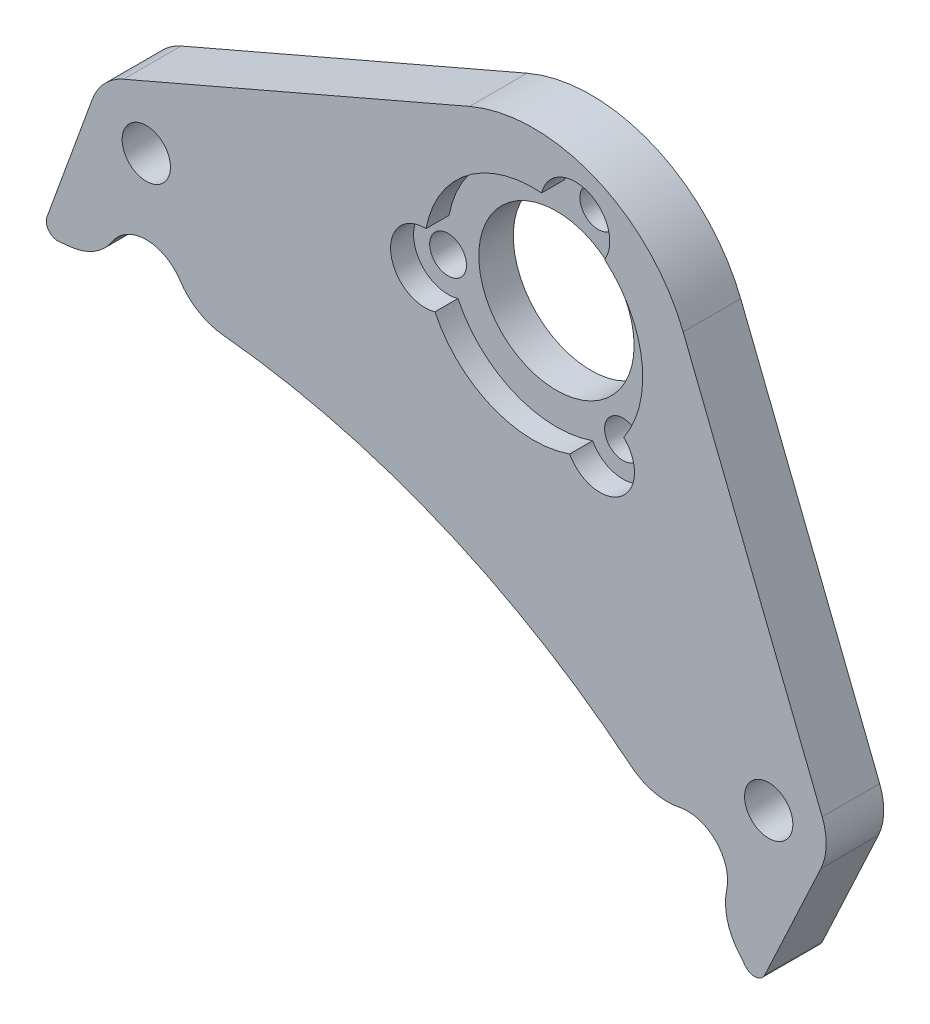
ISO-10303-21;
HEADER;
FILE_DESCRIPTION(('STEP AP214'),'2;1');
FILE_NAME('part.step','',(''),(''),'','','');
FILE_SCHEMA(('AUTOMOTIVE_DESIGN { 1 0 10303 214 1 1 1 1 }'));
ENDSEC;
DATA;
#1=APPLICATION_CONTEXT('core data for automotive mechanical design processes');
#2=APPLICATION_PROTOCOL_DEFINITION('international standard','automotive_design',2000,#1);
#3=PRODUCT_CONTEXT('',#1,'mechanical');
#4=PRODUCT('Part','Part','',(#3));
#5=PRODUCT_RELATED_PRODUCT_CATEGORY('part','',(#4));
#6=PRODUCT_DEFINITION_FORMATION('','',#4);
#7=PRODUCT_DEFINITION_CONTEXT('part definition',#1,'design');
#8=PRODUCT_DEFINITION('design','',#6,#7);
#9=PRODUCT_DEFINITION_SHAPE('','',#8);
#10=(LENGTH_UNIT() NAMED_UNIT(*) SI_UNIT(.MILLI.,.METRE.));
#11=(NAMED_UNIT(*) PLANE_ANGLE_UNIT() SI_UNIT($,.RADIAN.));
#12=(NAMED_UNIT(*) SI_UNIT($,.STERADIAN.) SOLID_ANGLE_UNIT());
#13=UNCERTAINTY_MEASURE_WITH_UNIT(LENGTH_MEASURE(1.E-05),#10,'distance_accuracy_value','');
#14=(GEOMETRIC_REPRESENTATION_CONTEXT(3) GLOBAL_UNCERTAINTY_ASSIGNED_CONTEXT((#13)) GLOBAL_UNIT_ASSIGNED_CONTEXT((#10,
#11,#12)) REPRESENTATION_CONTEXT('',''));
#15=CARTESIAN_POINT('',(0.,0.,0.));
#16=DIRECTION('',(0.,0.,1.));
#17=DIRECTION('',(1.,0.,0.));
#18=AXIS2_PLACEMENT_3D('',#15,#16,#17);
#19=CARTESIAN_POINT('',(33.6474407907006,81.2321078960549,5.));
#20=DIRECTION('',(0.,0.,-1.));
#21=DIRECTION('',(-1.,0.,0.));
#22=AXIS2_PLACEMENT_3D('',#19,#20,#21);
#23=CYLINDRICAL_SURFACE('',#22,6.75000000000001);
#24=CARTESIAN_POINT('',(33.6474407907006,81.2321078960549,0.));
#25=DIRECTION('',(0.,0.,1.));
#26=DIRECTION('',(1.,0.,0.));
#27=AXIS2_PLACEMENT_3D('',#24,#25,#26);
#28=CIRCLE('',#27,6.75000000000001);
#29=CARTESIAN_POINT('',(40.3974407907006,81.2321078960549,0.));
#30=VERTEX_POINT('',#29);
#31=EDGE_CURVE('E275',#30,#30,#28,.T.);
#32=ORIENTED_EDGE('',*,*,#31,.F.);
#33=EDGE_LOOP('',(#32));
#34=FACE_BOUND('',#33,.T.);
#35=CARTESIAN_POINT('',(33.6474407907006,81.2321078960549,3.));
#36=DIRECTION('',(0.,0.,1.));
#37=DIRECTION('',(1.,0.,0.));
#38=AXIS2_PLACEMENT_3D('',#35,#36,#37);
#39=CIRCLE('',#38,6.75000000000001);
#40=CARTESIAN_POINT('',(40.3974407907006,81.2321078960549,3.));
#41=VERTEX_POINT('',#40);
#42=EDGE_CURVE('E11',#41,#41,#39,.T.);
#43=ORIENTED_EDGE('',*,*,#42,.T.);
#44=EDGE_LOOP('',(#43));
#45=FACE_BOUND('',#44,.T.);
#46=ADVANCED_FACE('F45',(#34,#45),#23,.F.);
#47=CARTESIAN_POINT('',(37.282933398169,90.0089634549121,5.));
#48=DIRECTION('',(0.,0.,-1.));
#49=DIRECTION('',(-1.,0.,0.));
#50=AXIS2_PLACEMENT_3D('',#47,#48,#49);
#51=CYLINDRICAL_SURFACE('',#50,1.60000000000001);
#52=CARTESIAN_POINT('',(37.282933398169,90.0089634549121,0.));
#53=DIRECTION('',(0.,0.,1.));
#54=DIRECTION('',(1.,0.,0.));
#55=AXIS2_PLACEMENT_3D('',#52,#53,#54);
#56=CIRCLE('',#55,1.60000000000001);
#57=CARTESIAN_POINT('',(38.882933398169,90.0089634549121,0.));
#58=VERTEX_POINT('',#57);
#59=EDGE_CURVE('E290',#58,#58,#56,.T.);
#60=ORIENTED_EDGE('',*,*,#59,.F.);
#61=EDGE_LOOP('',(#60));
#62=FACE_BOUND('',#61,.T.);
#63=CARTESIAN_POINT('',(37.282933398169,90.0089634549121,3.));
#64=DIRECTION('',(0.,0.,1.));
#65=DIRECTION('',(1.,0.,0.));
#66=AXIS2_PLACEMENT_3D('',#63,#64,#65);
#67=CIRCLE('',#66,1.60000000000001);
#68=CARTESIAN_POINT('',(38.882933398169,90.0089634549121,3.));
#69=VERTEX_POINT('',#68);
#70=EDGE_CURVE('E258',#69,#69,#67,.T.);
#71=ORIENTED_EDGE('',*,*,#70,.T.);
#72=EDGE_LOOP('',(#71));
#73=FACE_BOUND('',#72,.T.);
#74=ADVANCED_FACE('F574',(#62,#73),#51,.F.);
#75=CARTESIAN_POINT('',(39.4306743662834,73.6952511632881,5.));
#76=DIRECTION('',(0.,0.,-1.));
#77=DIRECTION('',(-1.,0.,0.));
#78=AXIS2_PLACEMENT_3D('',#75,#76,#77);
#79=CYLINDRICAL_SURFACE('',#78,1.60000000000002);
#80=CARTESIAN_POINT('',(39.4306743662834,73.6952511632881,0.));
#81=DIRECTION('',(0.,0.,1.));
#82=DIRECTION('',(1.,0.,0.));
#83=AXIS2_PLACEMENT_3D('',#80,#81,#82);
#84=CIRCLE('',#83,1.60000000000002);
#85=CARTESIAN_POINT('',(41.0306743662834,73.6952511632881,0.));
#86=VERTEX_POINT('',#85);
#87=EDGE_CURVE('E286',#86,#86,#84,.T.);
#88=ORIENTED_EDGE('',*,*,#87,.F.);
#89=EDGE_LOOP('',(#88));
#90=FACE_BOUND('',#89,.T.);
#91=CARTESIAN_POINT('',(39.4306743662834,73.6952511632881,3.));
#92=DIRECTION('',(0.,0.,1.));
#93=DIRECTION('',(1.,0.,0.));
#94=AXIS2_PLACEMENT_3D('',#91,#92,#93);
#95=CIRCLE('',#94,1.60000000000002);
#96=CARTESIAN_POINT('',(41.0306743662834,73.6952511632881,3.));
#97=VERTEX_POINT('',#96);
#98=EDGE_CURVE('E235',#97,#97,#95,.T.);
#99=ORIENTED_EDGE('',*,*,#98,.T.);
#100=EDGE_LOOP('',(#99));
#101=FACE_BOUND('',#100,.T.);
#102=ADVANCED_FACE('F581',(#90,#101),#79,.F.);
#103=CARTESIAN_POINT('',(24.2287146076494,79.9921090699644,5.));
#104=DIRECTION('',(0.,0.,-1.));
#105=DIRECTION('',(-1.,0.,0.));
#106=AXIS2_PLACEMENT_3D('',#103,#104,#105);
#107=CYLINDRICAL_SURFACE('',#106,1.60000000000001);
#108=CARTESIAN_POINT('',(24.2287146076494,79.9921090699644,0.));
#109=DIRECTION('',(0.,0.,1.));
#110=DIRECTION('',(1.,0.,0.));
#111=AXIS2_PLACEMENT_3D('',#108,#109,#110);
#112=CIRCLE('',#111,1.60000000000001);
#113=CARTESIAN_POINT('',(25.8287146076494,79.9921090699644,0.));
#114=VERTEX_POINT('',#113);
#115=EDGE_CURVE('E282',#114,#114,#112,.T.);
#116=ORIENTED_EDGE('',*,*,#115,.F.);
#117=EDGE_LOOP('',(#116));
#118=FACE_BOUND('',#117,.T.);
#119=CARTESIAN_POINT('',(24.2287146076494,79.9921090699644,3.));
#120=DIRECTION('',(0.,0.,1.));
#121=DIRECTION('',(1.,0.,0.));
#122=AXIS2_PLACEMENT_3D('',#119,#120,#121);
#123=CIRCLE('',#122,1.60000000000001);
#124=CARTESIAN_POINT('',(25.8287146076494,79.9921090699644,3.));
#125=VERTEX_POINT('',#124);
#126=EDGE_CURVE('E230',#125,#125,#123,.T.);
#127=ORIENTED_EDGE('',*,*,#126,.T.);
#128=EDGE_LOOP('',(#127));
#129=FACE_BOUND('',#128,.T.);
#130=ADVANCED_FACE('F590',(#118,#129),#107,.F.);
#131=CARTESIAN_POINT('',(0.,76.5,5.));
#132=DIRECTION('',(0.,0.,-1.));
#133=DIRECTION('',(-1.,0.,0.));
#134=AXIS2_PLACEMENT_3D('',#131,#132,#133);
#135=PLANE('',#134);
#136=DIRECTION('',(-0.342020143325663,-0.93969262078591,0.));
#137=VECTOR('',#136,1.);
#138=CARTESIAN_POINT('',(-4.69846310392955,78.2101007166283,5.));
#139=LINE('',#138,#137);
#140=CARTESIAN_POINT('',(-4.69846310392955,78.2101007166283,5.));
#141=VERTEX_POINT('',#140);
#142=CARTESIAN_POINT('',(-8.6321964664029,67.4022571290773,5.));
#143=VERTEX_POINT('',#142);
#144=EDGE_CURVE('E299',#141,#143,#139,.T.);
#145=ORIENTED_EDGE('',*,*,#144,.T.);
#146=CARTESIAN_POINT('',(-7.69250384561699,67.0602369857516,5.));
#147=DIRECTION('',(0.,0.,-1.));
#148=DIRECTION('',(-1.,0.,0.));
#149=AXIS2_PLACEMENT_3D('',#146,#147,#148);
#150=CIRCLE('',#149,1.);
#151=CARTESIAN_POINT('',(-7.57854082568193,66.0667519933701,5.));
#152=VERTEX_POINT('',#151);
#153=EDGE_CURVE('E472',#143,#152,#150,.F.);
#154=ORIENTED_EDGE('',*,*,#153,.T.);
#155=CARTESIAN_POINT('',(0.,0.,5.));
#156=DIRECTION('',(0.,0.,-1.));
#157=DIRECTION('',(-1.,0.,0.));
#158=AXIS2_PLACEMENT_3D('',#155,#156,#157);
#159=CIRCLE('',#158,66.5);
#160=CARTESIAN_POINT('',(-6.62092343232267,66.1695804195804,5.));
#161=VERTEX_POINT('',#160);
#162=EDGE_CURVE('E304',#152,#161,#159,.T.);
#163=ORIENTED_EDGE('',*,*,#162,.T.);
#164=CARTESIAN_POINT('',(-7.11873722422663,71.1447368421053,5.));
#165=DIRECTION('',(0.,0.,-1.));
#166=DIRECTION('',(-1.,0.,0.));
#167=AXIS2_PLACEMENT_3D('',#164,#165,#166);
#168=CIRCLE('',#167,5.);
#169=CARTESIAN_POINT('',(-2.93124473938744,68.4125386996904,5.));
#170=VERTEX_POINT('',#169);
#171=EDGE_CURVE('E435',#161,#170,#168,.F.);
#172=ORIENTED_EDGE('',*,*,#171,.T.);
#173=CARTESIAN_POINT('',(0.,66.5,5.));
#174=DIRECTION('',(0.,0.,-1.));
#175=DIRECTION('',(-1.,0.,0.));
#176=AXIS2_PLACEMENT_3D('',#173,#174,#175);
#177=CIRCLE('',#176,3.5);
#178=CARTESIAN_POINT('',(2.93124473938744,68.4125386996904,5.));
#179=VERTEX_POINT('',#178);
#180=EDGE_CURVE('E307',#170,#179,#177,.T.);
#181=ORIENTED_EDGE('',*,*,#180,.T.);
#182=CARTESIAN_POINT('',(7.11873722422665,71.1447368421053,5.));
#183=DIRECTION('',(0.,0.,-1.));
#184=DIRECTION('',(-1.,0.,0.));
#185=AXIS2_PLACEMENT_3D('',#182,#183,#184);
#186=CIRCLE('',#185,5.);
#187=CARTESIAN_POINT('',(6.62092343232268,66.1695804195804,5.));
#188=VERTEX_POINT('',#187);
#189=EDGE_CURVE('E432',#179,#188,#186,.F.);
#190=ORIENTED_EDGE('',*,*,#189,.T.);
#191=CARTESIAN_POINT('',(0.,0.,5.));
#192=DIRECTION('',(0.,0.,-1.));
#193=DIRECTION('',(-1.,0.,0.));
#194=AXIS2_PLACEMENT_3D('',#191,#192,#193);
#195=CIRCLE('',#194,66.5);
#196=CARTESIAN_POINT('',(42.1072591662417,51.4706588796661,5.));
#197=VERTEX_POINT('',#196);
#198=EDGE_CURVE('E311',#188,#197,#195,.T.);
#199=ORIENTED_EDGE('',*,*,#198,.T.);
#200=CARTESIAN_POINT('',(45.2732185020494,55.3406332315207,5.));
#201=DIRECTION('',(0.,0.,-1.));
#202=DIRECTION('',(-1.,0.,0.));
#203=AXIS2_PLACEMENT_3D('',#200,#201,#202);
#204=CIRCLE('',#203,5.);
#205=CARTESIAN_POINT('',(46.3022670002,50.4476730652764,5.));
#206=VERTEX_POINT('',#205);
#207=EDGE_CURVE('E429',#197,#206,#204,.F.);
#208=ORIENTED_EDGE('',*,*,#207,.T.);
#209=CARTESIAN_POINT('',(47.0226009489055,47.0226009489053,5.));
#210=DIRECTION('',(0.,0.,-1.));
#211=DIRECTION('',(-1.,0.,0.));
#212=AXIS2_PLACEMENT_3D('',#209,#210,#211);
#213=CIRCLE('',#212,3.5);
#214=CARTESIAN_POINT('',(50.4476730652765,46.3022670001999,5.));
#215=VERTEX_POINT('',#214);
#216=EDGE_CURVE('E315',#206,#215,#213,.T.);
#217=ORIENTED_EDGE('',*,*,#216,.T.);
#218=CARTESIAN_POINT('',(55.3406332315209,45.2732185020493,5.));
#219=DIRECTION('',(0.,0.,-1.));
#220=DIRECTION('',(-1.,0.,0.));
#221=AXIS2_PLACEMENT_3D('',#218,#219,#220);
#222=CIRCLE('',#221,5.);
#223=CARTESIAN_POINT('',(51.4706588796662,42.1072591662416,5.));
#224=VERTEX_POINT('',#223);
#225=EDGE_CURVE('E426',#215,#224,#222,.F.);
#226=ORIENTED_EDGE('',*,*,#225,.T.);
#227=CARTESIAN_POINT('',(0.,0.,5.));
#228=DIRECTION('',(0.,0.,-1.));
#229=DIRECTION('',(-1.,0.,0.));
#230=AXIS2_PLACEMENT_3D('',#227,#228,#229);
#231=CIRCLE('',#230,66.5);
#232=CARTESIAN_POINT('',(52.0750859548207,41.357410736143,5.));
#233=VERTEX_POINT('',#232);
#234=EDGE_CURVE('E319',#224,#233,#231,.T.);
#235=ORIENTED_EDGE('',*,*,#234,.T.);
#236=CARTESIAN_POINT('',(52.8581699541414,41.9793266870624,5.));
#237=DIRECTION('',(0.,0.,-1.));
#238=DIRECTION('',(-1.,0.,0.));
#239=AXIS2_PLACEMENT_3D('',#236,#237,#238);
#240=CIRCLE('',#239,1.);
#241=CARTESIAN_POINT('',(53.764477741178,41.5567084253217,5.));
#242=VERTEX_POINT('',#241);
#243=EDGE_CURVE('E469',#233,#242,#240,.F.);
#244=ORIENTED_EDGE('',*,*,#243,.T.);
#245=DIRECTION('',(0.422618261740706,0.906307787036647,0.));
#246=VECTOR('',#245,1.);
#247=CARTESIAN_POINT('',(53.0715427057586,40.0707044464013,5.));
#248=LINE('',#247,#246);
#249=CARTESIAN_POINT('',(58.6252076959542,51.9805774520673,5.));
#250=VERTEX_POINT('',#249);
#251=EDGE_CURVE('E323',#242,#250,#248,.T.);
#252=ORIENTED_EDGE('',*,*,#251,.T.);
#253=CARTESIAN_POINT('',(54.0936687607709,54.0936687607709,5.));
#254=DIRECTION('',(0.,0.,1.));
#255=DIRECTION('',(-1.,0.,0.));
#256=AXIS2_PLACEMENT_3D('',#253,#254,#255);
#257=CIRCLE('',#256,5.00000000000013);
#258=CARTESIAN_POINT('',(58.7414212840115,55.937142786276,5.));
#259=VERTEX_POINT('',#258);
#260=EDGE_CURVE('E326',#250,#259,#257,.T.);
#261=ORIENTED_EDGE('',*,*,#260,.T.);
#262=DIRECTION('',(-0.368694805101005,0.929550504648097,0.));
#263=VECTOR('',#262,1.);
#264=CARTESIAN_POINT('',(58.7414212840115,55.937142786276,5.));
#265=LINE('',#264,#263);
#266=CARTESIAN_POINT('',(46.661147855774,86.3938351674689,5.));
#267=VERTEX_POINT('',#266);
#268=EDGE_CURVE('E329',#259,#267,#265,.T.);
#269=ORIENTED_EDGE('',*,*,#268,.T.);
#270=CARTESIAN_POINT('',(33.6474407907006,81.2321078960549,5.));
#271=DIRECTION('',(0.,0.,1.));
#272=DIRECTION('',(-1.,0.,0.));
#273=AXIS2_PLACEMENT_3D('',#270,#271,#272);
#274=CIRCLE('',#273,14.);
#275=CARTESIAN_POINT('',(28.0952526328644,94.0840807663959,5.));
#276=VERTEX_POINT('',#275);
#277=EDGE_CURVE('E332',#267,#276,#274,.T.);
#278=ORIENTED_EDGE('',*,*,#277,.T.);
#279=DIRECTION('',(-0.917998062167219,-0.396584868416875,0.));
#280=VECTOR('',#279,1.);
#281=CARTESIAN_POINT('',(-1.98292434208429,81.0899903108361,5.));
#282=LINE('',#281,#280);
#283=CARTESIAN_POINT('',(-1.98292434208429,81.0899903108361,5.));
#284=VERTEX_POINT('',#283);
#285=EDGE_CURVE('E335',#276,#284,#282,.T.);
#286=ORIENTED_EDGE('',*,*,#285,.T.);
#287=CARTESIAN_POINT('',(0.,76.5,5.));
#288=DIRECTION('',(0.,0.,1.));
#289=DIRECTION('',(-1.,0.,0.));
#290=AXIS2_PLACEMENT_3D('',#287,#288,#289);
#291=CIRCLE('',#290,5.);
#292=EDGE_CURVE('E295',#284,#141,#291,.T.);
#293=ORIENTED_EDGE('',*,*,#292,.T.);
#294=EDGE_LOOP('',(#145,#154,#163,#172,#181,#190,#199,#208,#217,#226,#235,#244,#252,#261,#269,
#278,#286,#293));
#295=FACE_BOUND('',#294,.T.);
#296=CARTESIAN_POINT('',(24.228714607649,79.9921090699647,5.));
#297=DIRECTION('',(0.,0.,1.));
#298=DIRECTION('',(1.,0.,0.));
#299=AXIS2_PLACEMENT_3D('',#296,#297,#298);
#300=CIRCLE('',#299,3.00000000000001);
#301=CARTESIAN_POINT('',(24.3116797888947,82.990961646985,5.));
#302=VERTEX_POINT('',#301);
#303=CARTESIAN_POINT('',(25.0850129792844,77.1169128855741,5.));
#304=VERTEX_POINT('',#303);
#305=EDGE_CURVE('E248',#302,#304,#300,.T.);
#306=ORIENTED_EDGE('',*,*,#305,.F.);
#307=CARTESIAN_POINT('',(33.6474407907006,81.2321078960549,5.));
#308=DIRECTION('',(0.,0.,1.));
#309=DIRECTION('',(1.,0.,0.));
#310=AXIS2_PLACEMENT_3D('',#307,#308,#309);
#311=CIRCLE('',#310,9.49999999999999);
#312=CARTESIAN_POINT('',(34.3647912758049,90.7049854040521,5.));
#313=VERTEX_POINT('',#312);
#314=EDGE_CURVE('E890',#313,#302,#311,.T.);
#315=ORIENTED_EDGE('',*,*,#314,.F.);
#316=CARTESIAN_POINT('',(37.282933398169,90.0089634549121,5.));
#317=DIRECTION('',(0.,0.,1.));
#318=DIRECTION('',(1.,0.,0.));
#319=AXIS2_PLACEMENT_3D('',#316,#317,#318);
#320=CIRCLE('',#319,3.);
#321=CARTESIAN_POINT('',(39.8385333214503,88.437687211814,5.));
#322=VERTEX_POINT('',#321);
#323=EDGE_CURVE('E223',#322,#313,#320,.T.);
#324=ORIENTED_EDGE('',*,*,#323,.F.);
#325=CARTESIAN_POINT('',(41.4925181170123,75.8744253985388,5.));
#326=VERTEX_POINT('',#325);
#327=EDGE_CURVE('E891',#326,#322,#311,.T.);
#328=ORIENTED_EDGE('',*,*,#327,.F.);
#329=CARTESIAN_POINT('',(39.4306743662834,73.6952511632881,5.));
#330=DIRECTION('',(0.,0.,1.));
#331=DIRECTION('',(1.,0.,0.));
#332=AXIS2_PLACEMENT_3D('',#329,#330,#331);
#333=CIRCLE('',#332,3.00000000000005);
#334=CARTESIAN_POINT('',(36.7921092617568,72.267674829366,5.));
#335=VERTEX_POINT('',#334);
#336=EDGE_CURVE('E237',#335,#326,#333,.T.);
#337=ORIENTED_EDGE('',*,*,#336,.F.);
#338=EDGE_CURVE('E881',#304,#335,#311,.T.);
#339=ORIENTED_EDGE('',*,*,#338,.F.);
#340=EDGE_LOOP('',(#306,#315,#324,#328,#337,#339));
#341=FACE_BOUND('',#340,.T.);
#342=CARTESIAN_POINT('',(0.,76.5,5.));
#343=DIRECTION('',(0.,0.,1.));
#344=DIRECTION('',(1.,0.,0.));
#345=AXIS2_PLACEMENT_3D('',#342,#343,#344);
#346=CIRCLE('',#345,2.09999999999998);
#347=CARTESIAN_POINT('',(2.09999999999999,76.5,5.));
#348=VERTEX_POINT('',#347);
#349=EDGE_CURVE('E271',#348,#348,#346,.T.);
#350=ORIENTED_EDGE('',*,*,#349,.F.);
#351=EDGE_LOOP('',(#350));
#352=FACE_BOUND('',#351,.T.);
#353=CARTESIAN_POINT('',(54.0936687607709,54.0936687607709,5.));
#354=DIRECTION('',(0.,0.,1.));
#355=DIRECTION('',(1.,0.,0.));
#356=AXIS2_PLACEMENT_3D('',#353,#354,#355);
#357=CIRCLE('',#356,2.09999999999999);
#358=CARTESIAN_POINT('',(56.1936687607709,54.0936687607709,5.));
#359=VERTEX_POINT('',#358);
#360=EDGE_CURVE('E263',#359,#359,#357,.T.);
#361=ORIENTED_EDGE('',*,*,#360,.F.);
#362=EDGE_LOOP('',(#361));
#363=FACE_BOUND('',#362,.T.);
#364=ADVANCED_FACE('F488',(#295,#341,#352,#363),#135,.F.);
#365=CARTESIAN_POINT('',(0.,76.5,0.));
#366=DIRECTION('',(0.,0.,-1.));
#367=DIRECTION('',(-1.,0.,0.));
#368=AXIS2_PLACEMENT_3D('',#365,#366,#367);
#369=PLANE('',#368);
#370=CARTESIAN_POINT('',(0.,76.5,0.));
#371=DIRECTION('',(0.,0.,1.));
#372=DIRECTION('',(1.,0.,0.));
#373=AXIS2_PLACEMENT_3D('',#370,#371,#372);
#374=CIRCLE('',#373,2.09999999999998);
#375=CARTESIAN_POINT('',(2.09999999999999,76.5,0.));
#376=VERTEX_POINT('',#375);
#377=EDGE_CURVE('E267',#376,#376,#374,.T.);
#378=ORIENTED_EDGE('',*,*,#377,.T.);
#379=EDGE_LOOP('',(#378));
#380=FACE_BOUND('',#379,.T.);
#381=ORIENTED_EDGE('',*,*,#115,.T.);
#382=EDGE_LOOP('',(#381));
#383=FACE_BOUND('',#382,.T.);
#384=ORIENTED_EDGE('',*,*,#59,.T.);
#385=EDGE_LOOP('',(#384));
#386=FACE_BOUND('',#385,.T.);
#387=CARTESIAN_POINT('',(0.,0.,0.));
#388=DIRECTION('',(0.,0.,-1.));
#389=DIRECTION('',(-1.,0.,0.));
#390=AXIS2_PLACEMENT_3D('',#387,#388,#389);
#391=CIRCLE('',#390,66.5);
#392=CARTESIAN_POINT('',(-7.57854082568193,66.0667519933701,0.));
#393=VERTEX_POINT('',#392);
#394=CARTESIAN_POINT('',(-6.62092343232267,66.1695804195804,0.));
#395=VERTEX_POINT('',#394);
#396=EDGE_CURVE('E346',#393,#395,#391,.T.);
#397=ORIENTED_EDGE('',*,*,#396,.F.);
#398=CARTESIAN_POINT('',(-7.69250384561699,67.0602369857516,0.));
#399=DIRECTION('',(0.,0.,-1.));
#400=DIRECTION('',(-1.,0.,0.));
#401=AXIS2_PLACEMENT_3D('',#398,#399,#400);
#402=CIRCLE('',#401,1.);
#403=CARTESIAN_POINT('',(-8.6321964664029,67.4022571290773,0.));
#404=VERTEX_POINT('',#403);
#405=EDGE_CURVE('E463',#393,#404,#402,.T.);
#406=ORIENTED_EDGE('',*,*,#405,.T.);
#407=DIRECTION('',(-0.342020143325663,-0.93969262078591,0.));
#408=VECTOR('',#407,1.);
#409=CARTESIAN_POINT('',(-4.69846310392955,78.2101007166283,0.));
#410=LINE('',#409,#408);
#411=CARTESIAN_POINT('',(-4.69846310392955,78.2101007166283,0.));
#412=VERTEX_POINT('',#411);
#413=EDGE_CURVE('E342',#412,#404,#410,.T.);
#414=ORIENTED_EDGE('',*,*,#413,.F.);
#415=CARTESIAN_POINT('',(0.,76.5,0.));
#416=DIRECTION('',(0.,0.,1.));
#417=DIRECTION('',(-1.,0.,0.));
#418=AXIS2_PLACEMENT_3D('',#415,#416,#417);
#419=CIRCLE('',#418,5.);
#420=CARTESIAN_POINT('',(-1.98292434208429,81.0899903108361,0.));
#421=VERTEX_POINT('',#420);
#422=EDGE_CURVE('E294',#421,#412,#419,.T.);
#423=ORIENTED_EDGE('',*,*,#422,.F.);
#424=DIRECTION('',(-0.917998062167219,-0.396584868416875,0.));
#425=VECTOR('',#424,1.);
#426=CARTESIAN_POINT('',(-1.98292434208429,81.0899903108361,0.));
#427=LINE('',#426,#425);
#428=CARTESIAN_POINT('',(28.0952526328644,94.0840807663959,0.));
#429=VERTEX_POINT('',#428);
#430=EDGE_CURVE('E300',#429,#421,#427,.T.);
#431=ORIENTED_EDGE('',*,*,#430,.F.);
#432=CARTESIAN_POINT('',(33.6474407907006,81.2321078960549,0.));
#433=DIRECTION('',(0.,0.,1.));
#434=DIRECTION('',(-1.,0.,0.));
#435=AXIS2_PLACEMENT_3D('',#432,#433,#434);
#436=CIRCLE('',#435,14.);
#437=CARTESIAN_POINT('',(46.661147855774,86.3938351674689,0.));
#438=VERTEX_POINT('',#437);
#439=EDGE_CURVE('E374',#438,#429,#436,.T.);
#440=ORIENTED_EDGE('',*,*,#439,.F.);
#441=DIRECTION('',(-0.368694805101005,0.929550504648097,0.));
#442=VECTOR('',#441,1.);
#443=CARTESIAN_POINT('',(58.7414212840115,55.937142786276,0.));
#444=LINE('',#443,#442);
#445=CARTESIAN_POINT('',(58.7414212840115,55.937142786276,0.));
#446=VERTEX_POINT('',#445);
#447=EDGE_CURVE('E371',#446,#438,#444,.T.);
#448=ORIENTED_EDGE('',*,*,#447,.F.);
#449=CARTESIAN_POINT('',(54.0936687607709,54.0936687607709,0.));
#450=DIRECTION('',(0.,0.,1.));
#451=DIRECTION('',(-1.,0.,0.));
#452=AXIS2_PLACEMENT_3D('',#449,#450,#451);
#453=CIRCLE('',#452,5.00000000000013);
#454=CARTESIAN_POINT('',(58.6252076959542,51.9805774520673,0.));
#455=VERTEX_POINT('',#454);
#456=EDGE_CURVE('E368',#455,#446,#453,.T.);
#457=ORIENTED_EDGE('',*,*,#456,.F.);
#458=DIRECTION('',(0.422618261740706,0.906307787036647,0.));
#459=VECTOR('',#458,1.);
#460=CARTESIAN_POINT('',(53.0715427057586,40.0707044464013,0.));
#461=LINE('',#460,#459);
#462=CARTESIAN_POINT('',(53.764477741178,41.5567084253217,0.));
#463=VERTEX_POINT('',#462);
#464=EDGE_CURVE('E365',#463,#455,#461,.T.);
#465=ORIENTED_EDGE('',*,*,#464,.F.);
#466=CARTESIAN_POINT('',(52.8581699541414,41.9793266870624,0.));
#467=DIRECTION('',(0.,0.,-1.));
#468=DIRECTION('',(-1.,0.,0.));
#469=AXIS2_PLACEMENT_3D('',#466,#467,#468);
#470=CIRCLE('',#469,1.);
#471=CARTESIAN_POINT('',(52.0750859548207,41.357410736143,0.));
#472=VERTEX_POINT('',#471);
#473=EDGE_CURVE('E460',#463,#472,#470,.T.);
#474=ORIENTED_EDGE('',*,*,#473,.T.);
#475=CARTESIAN_POINT('',(0.,0.,0.));
#476=DIRECTION('',(0.,0.,-1.));
#477=DIRECTION('',(-1.,0.,0.));
#478=AXIS2_PLACEMENT_3D('',#475,#476,#477);
#479=CIRCLE('',#478,66.5);
#480=CARTESIAN_POINT('',(51.4706588796662,42.1072591662416,0.));
#481=VERTEX_POINT('',#480);
#482=EDGE_CURVE('E361',#481,#472,#479,.T.);
#483=ORIENTED_EDGE('',*,*,#482,.F.);
#484=CARTESIAN_POINT('',(55.3406332315209,45.2732185020493,0.));
#485=DIRECTION('',(0.,0.,-1.));
#486=DIRECTION('',(-1.,0.,0.));
#487=AXIS2_PLACEMENT_3D('',#484,#485,#486);
#488=CIRCLE('',#487,5.);
#489=CARTESIAN_POINT('',(50.4476730652765,46.3022670001999,0.));
#490=VERTEX_POINT('',#489);
#491=EDGE_CURVE('E409',#481,#490,#488,.T.);
#492=ORIENTED_EDGE('',*,*,#491,.T.);
#493=CARTESIAN_POINT('',(47.0226009489055,47.0226009489053,0.));
#494=DIRECTION('',(0.,0.,-1.));
#495=DIRECTION('',(-1.,0.,0.));
#496=AXIS2_PLACEMENT_3D('',#493,#494,#495);
#497=CIRCLE('',#496,3.5);
#498=CARTESIAN_POINT('',(46.3022670002,50.4476730652764,0.));
#499=VERTEX_POINT('',#498);
#500=EDGE_CURVE('E357',#499,#490,#497,.T.);
#501=ORIENTED_EDGE('',*,*,#500,.F.);
#502=CARTESIAN_POINT('',(45.2732185020494,55.3406332315207,0.));
#503=DIRECTION('',(0.,0.,-1.));
#504=DIRECTION('',(-1.,0.,0.));
#505=AXIS2_PLACEMENT_3D('',#502,#503,#504);
#506=CIRCLE('',#505,5.);
#507=CARTESIAN_POINT('',(42.1072591662417,51.4706588796661,0.));
#508=VERTEX_POINT('',#507);
#509=EDGE_CURVE('E412',#499,#508,#506,.T.);
#510=ORIENTED_EDGE('',*,*,#509,.T.);
#511=CARTESIAN_POINT('',(0.,0.,0.));
#512=DIRECTION('',(0.,0.,-1.));
#513=DIRECTION('',(-1.,0.,0.));
#514=AXIS2_PLACEMENT_3D('',#511,#512,#513);
#515=CIRCLE('',#514,66.5);
#516=CARTESIAN_POINT('',(6.62092343232268,66.1695804195804,0.));
#517=VERTEX_POINT('',#516);
#518=EDGE_CURVE('E353',#517,#508,#515,.T.);
#519=ORIENTED_EDGE('',*,*,#518,.F.);
#520=CARTESIAN_POINT('',(7.11873722422665,71.1447368421053,0.));
#521=DIRECTION('',(0.,0.,-1.));
#522=DIRECTION('',(-1.,0.,0.));
#523=AXIS2_PLACEMENT_3D('',#520,#521,#522);
#524=CIRCLE('',#523,5.);
#525=CARTESIAN_POINT('',(2.93124473938744,68.4125386996904,0.));
#526=VERTEX_POINT('',#525);
#527=EDGE_CURVE('E415',#517,#526,#524,.T.);
#528=ORIENTED_EDGE('',*,*,#527,.T.);
#529=CARTESIAN_POINT('',(0.,66.5,0.));
#530=DIRECTION('',(0.,0.,-1.));
#531=DIRECTION('',(-1.,0.,0.));
#532=AXIS2_PLACEMENT_3D('',#529,#530,#531);
#533=CIRCLE('',#532,3.5);
#534=CARTESIAN_POINT('',(-2.93124473938744,68.4125386996904,0.));
#535=VERTEX_POINT('',#534);
#536=EDGE_CURVE('E349',#535,#526,#533,.T.);
#537=ORIENTED_EDGE('',*,*,#536,.F.);
#538=CARTESIAN_POINT('',(-7.11873722422663,71.1447368421053,0.));
#539=DIRECTION('',(0.,0.,-1.));
#540=DIRECTION('',(-1.,0.,0.));
#541=AXIS2_PLACEMENT_3D('',#538,#539,#540);
#542=CIRCLE('',#541,5.);
#543=EDGE_CURVE('E418',#535,#395,#542,.T.);
#544=ORIENTED_EDGE('',*,*,#543,.T.);
#545=EDGE_LOOP('',(#397,#406,#414,#423,#431,#440,#448,#457,#465,#474,#483,#492,#501,#510,#519,
#528,#537,#544));
#546=FACE_BOUND('',#545,.T.);
#547=ORIENTED_EDGE('',*,*,#87,.T.);
#548=EDGE_LOOP('',(#547));
#549=FACE_BOUND('',#548,.T.);
#550=ORIENTED_EDGE('',*,*,#31,.T.);
#551=EDGE_LOOP('',(#550));
#552=FACE_BOUND('',#551,.T.);
#553=CARTESIAN_POINT('',(54.0936687607709,54.0936687607709,0.));
#554=DIRECTION('',(0.,0.,1.));
#555=DIRECTION('',(1.,0.,0.));
#556=AXIS2_PLACEMENT_3D('',#553,#554,#555);
#557=CIRCLE('',#556,2.09999999999999);
#558=CARTESIAN_POINT('',(56.1936687607709,54.0936687607709,0.));
#559=VERTEX_POINT('',#558);
#560=EDGE_CURVE('E262',#559,#559,#557,.T.);
#561=ORIENTED_EDGE('',*,*,#560,.T.);
#562=EDGE_LOOP('',(#561));
#563=FACE_BOUND('',#562,.T.);
#564=ADVANCED_FACE('F500',(#380,#383,#386,#546,#549,#552,#563),#369,.T.);
#565=CARTESIAN_POINT('',(0.,76.5,5.));
#566=DIRECTION('',(0.,0.,-1.));
#567=DIRECTION('',(-1.,0.,0.));
#568=AXIS2_PLACEMENT_3D('',#565,#566,#567);
#569=CYLINDRICAL_SURFACE('',#568,5.);
#570=ORIENTED_EDGE('',*,*,#422,.T.);
#571=DIRECTION('',(0.,0.,-1.));
#572=VECTOR('',#571,1.);
#573=CARTESIAN_POINT('',(-4.69846310392955,78.2101007166283,5.));
#574=LINE('',#573,#572);
#575=EDGE_CURVE('E398',#141,#412,#574,.T.);
#576=ORIENTED_EDGE('',*,*,#575,.F.);
#577=ORIENTED_EDGE('',*,*,#292,.F.);
#578=DIRECTION('',(0.,0.,-1.));
#579=VECTOR('',#578,1.);
#580=CARTESIAN_POINT('',(-1.98292434208429,81.0899903108361,5.));
#581=LINE('',#580,#579);
#582=EDGE_CURVE('E338',#284,#421,#581,.T.);
#583=ORIENTED_EDGE('',*,*,#582,.T.);
#584=EDGE_LOOP('',(#570,#576,#577,#583));
#585=FACE_BOUND('',#584,.T.);
#586=ADVANCED_FACE('F525',(#585),#569,.T.);
#587=CARTESIAN_POINT('',(-4.69846310392955,78.2101007166283,5.));
#588=DIRECTION('',(0.93969262078591,-0.342020143325663,0.));
#589=DIRECTION('',(0.342020143325663,0.93969262078591,0.));
#590=AXIS2_PLACEMENT_3D('',#587,#588,#589);
#591=PLANE('',#590);
#592=ORIENTED_EDGE('',*,*,#413,.T.);
#593=DIRECTION('',(0.,0.,-1.));
#594=VECTOR('',#593,1.);
#595=CARTESIAN_POINT('',(-8.6321964664029,67.4022571290773,5.));
#596=LINE('',#595,#594);
#597=EDGE_CURVE('E466',#404,#143,#596,.F.);
#598=ORIENTED_EDGE('',*,*,#597,.T.);
#599=ORIENTED_EDGE('',*,*,#144,.F.);
#600=ORIENTED_EDGE('',*,*,#575,.T.);
#601=EDGE_LOOP('',(#592,#598,#599,#600));
#602=FACE_BOUND('',#601,.T.);
#603=ADVANCED_FACE('F621',(#602),#591,.F.);
#604=CARTESIAN_POINT('',(0.,0.,5.));
#605=DIRECTION('',(0.,0.,-1.));
#606=DIRECTION('',(-1.,0.,0.));
#607=AXIS2_PLACEMENT_3D('',#604,#605,#606);
#608=CYLINDRICAL_SURFACE('',#607,66.5);
#609=ORIENTED_EDGE('',*,*,#162,.F.);
#610=DIRECTION('',(0.,0.,-1.));
#611=VECTOR('',#610,1.);
#612=CARTESIAN_POINT('',(-7.57854082568193,66.0667519933701,5.));
#613=LINE('',#612,#611);
#614=EDGE_CURVE('E456',#152,#393,#613,.T.);
#615=ORIENTED_EDGE('',*,*,#614,.T.);
#616=ORIENTED_EDGE('',*,*,#396,.T.);
#617=DIRECTION('',(0.,0.,-1.));
#618=VECTOR('',#617,1.);
#619=CARTESIAN_POINT('',(-6.62092343232267,66.1695804195804,5.));
#620=LINE('',#619,#618);
#621=EDGE_CURVE('E422',#395,#161,#620,.F.);
#622=ORIENTED_EDGE('',*,*,#621,.T.);
#623=EDGE_LOOP('',(#609,#615,#616,#622));
#624=FACE_BOUND('',#623,.T.);
#625=ADVANCED_FACE('F534',(#624),#608,.F.);
#626=CARTESIAN_POINT('',(0.,66.5,5.));
#627=DIRECTION('',(0.,0.,-1.));
#628=DIRECTION('',(-1.,0.,0.));
#629=AXIS2_PLACEMENT_3D('',#626,#627,#628);
#630=CYLINDRICAL_SURFACE('',#629,3.5);
#631=ORIENTED_EDGE('',*,*,#180,.F.);
#632=DIRECTION('',(0.,0.,-1.));
#633=VECTOR('',#632,1.);
#634=CARTESIAN_POINT('',(-2.93124473938744,68.4125386996904,5.));
#635=LINE('',#634,#633);
#636=EDGE_CURVE('E405',#170,#535,#635,.T.);
#637=ORIENTED_EDGE('',*,*,#636,.T.);
#638=ORIENTED_EDGE('',*,*,#536,.T.);
#639=DIRECTION('',(0.,0.,-1.));
#640=VECTOR('',#639,1.);
#641=CARTESIAN_POINT('',(2.93124473938744,68.4125386996904,5.));
#642=LINE('',#641,#640);
#643=EDGE_CURVE('E402',#526,#179,#642,.F.);
#644=ORIENTED_EDGE('',*,*,#643,.T.);
#645=EDGE_LOOP('',(#631,#637,#638,#644));
#646=FACE_BOUND('',#645,.T.);
#647=ADVANCED_FACE('F544',(#646),#630,.F.);
#648=CARTESIAN_POINT('',(0.,0.,5.));
#649=DIRECTION('',(0.,0.,-1.));
#650=DIRECTION('',(-1.,0.,0.));
#651=AXIS2_PLACEMENT_3D('',#648,#649,#650);
#652=CYLINDRICAL_SURFACE('',#651,66.5);
#653=ORIENTED_EDGE('',*,*,#198,.F.);
#654=DIRECTION('',(0.,0.,-1.));
#655=VECTOR('',#654,1.);
#656=CARTESIAN_POINT('',(6.62092343232269,66.1695804195804,5.));
#657=LINE('',#656,#655);
#658=EDGE_CURVE('E441',#188,#517,#657,.T.);
#659=ORIENTED_EDGE('',*,*,#658,.T.);
#660=ORIENTED_EDGE('',*,*,#518,.T.);
#661=DIRECTION('',(0.,0.,-1.));
#662=VECTOR('',#661,1.);
#663=CARTESIAN_POINT('',(42.1072591662417,51.4706588796661,5.));
#664=LINE('',#663,#662);
#665=EDGE_CURVE('E438',#508,#197,#664,.F.);
#666=ORIENTED_EDGE('',*,*,#665,.T.);
#667=EDGE_LOOP('',(#653,#659,#660,#666));
#668=FACE_BOUND('',#667,.T.);
#669=ADVANCED_FACE('F552',(#668),#652,.F.);
#670=CARTESIAN_POINT('',(47.0226009489055,47.0226009489053,5.));
#671=DIRECTION('',(0.,0.,-1.));
#672=DIRECTION('',(-1.,0.,0.));
#673=AXIS2_PLACEMENT_3D('',#670,#671,#672);
#674=CYLINDRICAL_SURFACE('',#673,3.5);
#675=ORIENTED_EDGE('',*,*,#216,.F.);
#676=DIRECTION('',(0.,0.,-1.));
#677=VECTOR('',#676,1.);
#678=CARTESIAN_POINT('',(46.3022670002,50.4476730652764,5.));
#679=LINE('',#678,#677);
#680=EDGE_CURVE('E448',#206,#499,#679,.T.);
#681=ORIENTED_EDGE('',*,*,#680,.T.);
#682=ORIENTED_EDGE('',*,*,#500,.T.);
#683=DIRECTION('',(0.,0.,-1.));
#684=VECTOR('',#683,1.);
#685=CARTESIAN_POINT('',(50.4476730652765,46.3022670001999,5.));
#686=LINE('',#685,#684);
#687=EDGE_CURVE('E445',#490,#215,#686,.F.);
#688=ORIENTED_EDGE('',*,*,#687,.T.);
#689=EDGE_LOOP('',(#675,#681,#682,#688));
#690=FACE_BOUND('',#689,.T.);
#691=ADVANCED_FACE('F560',(#690),#674,.F.);
#692=CARTESIAN_POINT('',(0.,0.,5.));
#693=DIRECTION('',(0.,0.,-1.));
#694=DIRECTION('',(-1.,0.,0.));
#695=AXIS2_PLACEMENT_3D('',#692,#693,#694);
#696=CYLINDRICAL_SURFACE('',#695,66.5);
#697=ORIENTED_EDGE('',*,*,#482,.T.);
#698=DIRECTION('',(0.,0.,-1.));
#699=VECTOR('',#698,1.);
#700=CARTESIAN_POINT('',(52.0750859548207,41.357410736143,5.));
#701=LINE('',#700,#699);
#702=EDGE_CURVE('E54',#472,#233,#701,.F.);
#703=ORIENTED_EDGE('',*,*,#702,.T.);
#704=ORIENTED_EDGE('',*,*,#234,.F.);
#705=DIRECTION('',(0.,0.,-1.));
#706=VECTOR('',#705,1.);
#707=CARTESIAN_POINT('',(51.4706588796662,42.1072591662416,5.));
#708=LINE('',#707,#706);
#709=EDGE_CURVE('E452',#224,#481,#708,.T.);
#710=ORIENTED_EDGE('',*,*,#709,.T.);
#711=EDGE_LOOP('',(#697,#703,#704,#710));
#712=FACE_BOUND('',#711,.T.);
#713=ADVANCED_FACE('F482',(#712),#696,.F.);
#714=CARTESIAN_POINT('',(53.0715427057586,40.0707044464013,5.));
#715=DIRECTION('',(-0.906307787036647,0.422618261740706,0.));
#716=DIRECTION('',(-0.422618261740706,-0.906307787036647,0.));
#717=AXIS2_PLACEMENT_3D('',#714,#715,#716);
#718=PLANE('',#717);
#719=ORIENTED_EDGE('',*,*,#251,.F.);
#720=DIRECTION('',(0.,0.,-1.));
#721=VECTOR('',#720,1.);
#722=CARTESIAN_POINT('',(53.764477741178,41.5567084253217,5.));
#723=LINE('',#722,#721);
#724=EDGE_CURVE('E475',#242,#463,#723,.T.);
#725=ORIENTED_EDGE('',*,*,#724,.T.);
#726=ORIENTED_EDGE('',*,*,#464,.T.);
#727=DIRECTION('',(0.,0.,-1.));
#728=VECTOR('',#727,1.);
#729=CARTESIAN_POINT('',(58.6252076959542,51.9805774520673,5.));
#730=LINE('',#729,#728);
#731=EDGE_CURVE('E394',#250,#455,#730,.T.);
#732=ORIENTED_EDGE('',*,*,#731,.F.);
#733=EDGE_LOOP('',(#719,#725,#726,#732));
#734=FACE_BOUND('',#733,.T.);
#735=ADVANCED_FACE('F495',(#734),#718,.F.);
#736=CARTESIAN_POINT('',(54.0936687607709,54.0936687607709,5.));
#737=DIRECTION('',(0.,0.,-1.));
#738=DIRECTION('',(-1.,0.,0.));
#739=AXIS2_PLACEMENT_3D('',#736,#737,#738);
#740=CYLINDRICAL_SURFACE('',#739,5.00000000000013);
#741=ORIENTED_EDGE('',*,*,#456,.T.);
#742=DIRECTION('',(0.,0.,-1.));
#743=VECTOR('',#742,1.);
#744=CARTESIAN_POINT('',(58.7414212840115,55.937142786276,5.));
#745=LINE('',#744,#743);
#746=EDGE_CURVE('E390',#259,#446,#745,.T.);
#747=ORIENTED_EDGE('',*,*,#746,.F.);
#748=ORIENTED_EDGE('',*,*,#260,.F.);
#749=ORIENTED_EDGE('',*,*,#731,.T.);
#750=EDGE_LOOP('',(#741,#747,#748,#749));
#751=FACE_BOUND('',#750,.T.);
#752=ADVANCED_FACE('F506',(#751),#740,.T.);
#753=CARTESIAN_POINT('',(58.7414212840115,55.937142786276,5.));
#754=DIRECTION('',(-0.929550504648097,-0.368694805101005,0.));
#755=DIRECTION('',(0.368694805101005,-0.929550504648097,0.));
#756=AXIS2_PLACEMENT_3D('',#753,#754,#755);
#757=PLANE('',#756);
#758=ORIENTED_EDGE('',*,*,#447,.T.);
#759=DIRECTION('',(0.,0.,-1.));
#760=VECTOR('',#759,1.);
#761=CARTESIAN_POINT('',(46.661147855774,86.3938351674689,5.));
#762=LINE('',#761,#760);
#763=EDGE_CURVE('E386',#267,#438,#762,.T.);
#764=ORIENTED_EDGE('',*,*,#763,.F.);
#765=ORIENTED_EDGE('',*,*,#268,.F.);
#766=ORIENTED_EDGE('',*,*,#746,.T.);
#767=EDGE_LOOP('',(#758,#764,#765,#766));
#768=FACE_BOUND('',#767,.T.);
#769=ADVANCED_FACE('F510',(#768),#757,.F.);
#770=CARTESIAN_POINT('',(33.6474407907006,81.2321078960549,5.));
#771=DIRECTION('',(0.,0.,-1.));
#772=DIRECTION('',(-1.,0.,0.));
#773=AXIS2_PLACEMENT_3D('',#770,#771,#772);
#774=CYLINDRICAL_SURFACE('',#773,14.);
#775=ORIENTED_EDGE('',*,*,#439,.T.);
#776=DIRECTION('',(0.,0.,-1.));
#777=VECTOR('',#776,1.);
#778=CARTESIAN_POINT('',(28.0952526328644,94.0840807663959,5.));
#779=LINE('',#778,#777);
#780=EDGE_CURVE('E382',#276,#429,#779,.T.);
#781=ORIENTED_EDGE('',*,*,#780,.F.);
#782=ORIENTED_EDGE('',*,*,#277,.F.);
#783=ORIENTED_EDGE('',*,*,#763,.T.);
#784=EDGE_LOOP('',(#775,#781,#782,#783));
#785=FACE_BOUND('',#784,.T.);
#786=ADVANCED_FACE('F517',(#785),#774,.T.);
#787=CARTESIAN_POINT('',(-1.98292434208429,81.0899903108361,5.));
#788=DIRECTION('',(0.396584868416875,-0.91799806216722,0.));
#789=DIRECTION('',(0.91799806216722,0.396584868416875,0.));
#790=AXIS2_PLACEMENT_3D('',#787,#788,#789);
#791=PLANE('',#790);
#792=ORIENTED_EDGE('',*,*,#430,.T.);
#793=ORIENTED_EDGE('',*,*,#582,.F.);
#794=ORIENTED_EDGE('',*,*,#285,.F.);
#795=ORIENTED_EDGE('',*,*,#780,.T.);
#796=EDGE_LOOP('',(#792,#793,#794,#795));
#797=FACE_BOUND('',#796,.T.);
#798=ADVANCED_FACE('F520',(#797),#791,.F.);
#799=CARTESIAN_POINT('',(0.,76.5,5.));
#800=DIRECTION('',(0.,0.,-1.));
#801=DIRECTION('',(-1.,0.,0.));
#802=AXIS2_PLACEMENT_3D('',#799,#800,#801);
#803=CYLINDRICAL_SURFACE('',#802,2.09999999999998);
#804=ORIENTED_EDGE('',*,*,#349,.T.);
#805=EDGE_LOOP('',(#804));
#806=FACE_BOUND('',#805,.T.);
#807=ORIENTED_EDGE('',*,*,#377,.F.);
#808=EDGE_LOOP('',(#807));
#809=FACE_BOUND('',#808,.T.);
#810=ADVANCED_FACE('F588',(#806,#809),#803,.F.);
#811=CARTESIAN_POINT('',(54.0936687607709,54.0936687607709,5.));
#812=DIRECTION('',(0.,0.,-1.));
#813=DIRECTION('',(-1.,0.,0.));
#814=AXIS2_PLACEMENT_3D('',#811,#812,#813);
#815=CYLINDRICAL_SURFACE('',#814,2.09999999999999);
#816=ORIENTED_EDGE('',*,*,#360,.T.);
#817=EDGE_LOOP('',(#816));
#818=FACE_BOUND('',#817,.T.);
#819=ORIENTED_EDGE('',*,*,#560,.F.);
#820=EDGE_LOOP('',(#819));
#821=FACE_BOUND('',#820,.T.);
#822=ADVANCED_FACE('F628',(#818,#821),#815,.F.);
#823=CARTESIAN_POINT('',(-7.11873722422663,71.1447368421053,5.));
#824=DIRECTION('',(0.,0.,-1.));
#825=DIRECTION('',(-1.,0.,0.));
#826=AXIS2_PLACEMENT_3D('',#823,#824,#825);
#827=CYLINDRICAL_SURFACE('',#826,5.);
#828=ORIENTED_EDGE('',*,*,#171,.F.);
#829=ORIENTED_EDGE('',*,*,#621,.F.);
#830=ORIENTED_EDGE('',*,*,#543,.F.);
#831=ORIENTED_EDGE('',*,*,#636,.F.);
#832=EDGE_LOOP('',(#828,#829,#830,#831));
#833=FACE_BOUND('',#832,.T.);
#834=ADVANCED_FACE('F540',(#833),#827,.T.);
#835=CARTESIAN_POINT('',(7.11873722422665,71.1447368421053,5.));
#836=DIRECTION('',(0.,0.,-1.));
#837=DIRECTION('',(-1.,0.,0.));
#838=AXIS2_PLACEMENT_3D('',#835,#836,#837);
#839=CYLINDRICAL_SURFACE('',#838,5.);
#840=ORIENTED_EDGE('',*,*,#189,.F.);
#841=ORIENTED_EDGE('',*,*,#643,.F.);
#842=ORIENTED_EDGE('',*,*,#527,.F.);
#843=ORIENTED_EDGE('',*,*,#658,.F.);
#844=EDGE_LOOP('',(#840,#841,#842,#843));
#845=FACE_BOUND('',#844,.T.);
#846=ADVANCED_FACE('F547',(#845),#839,.T.);
#847=CARTESIAN_POINT('',(45.2732185020494,55.3406332315207,5.));
#848=DIRECTION('',(0.,0.,-1.));
#849=DIRECTION('',(-1.,0.,0.));
#850=AXIS2_PLACEMENT_3D('',#847,#848,#849);
#851=CYLINDRICAL_SURFACE('',#850,5.);
#852=ORIENTED_EDGE('',*,*,#207,.F.);
#853=ORIENTED_EDGE('',*,*,#665,.F.);
#854=ORIENTED_EDGE('',*,*,#509,.F.);
#855=ORIENTED_EDGE('',*,*,#680,.F.);
#856=EDGE_LOOP('',(#852,#853,#854,#855));
#857=FACE_BOUND('',#856,.T.);
#858=ADVANCED_FACE('F556',(#857),#851,.T.);
#859=CARTESIAN_POINT('',(55.3406332315209,45.2732185020493,5.));
#860=DIRECTION('',(0.,0.,-1.));
#861=DIRECTION('',(-1.,0.,0.));
#862=AXIS2_PLACEMENT_3D('',#859,#860,#861);
#863=CYLINDRICAL_SURFACE('',#862,5.);
#864=ORIENTED_EDGE('',*,*,#225,.F.);
#865=ORIENTED_EDGE('',*,*,#687,.F.);
#866=ORIENTED_EDGE('',*,*,#491,.F.);
#867=ORIENTED_EDGE('',*,*,#709,.F.);
#868=EDGE_LOOP('',(#864,#865,#866,#867));
#869=FACE_BOUND('',#868,.T.);
#870=ADVANCED_FACE('F564',(#869),#863,.T.);
#871=CARTESIAN_POINT('',(-7.69250384561699,67.0602369857516,5.));
#872=DIRECTION('',(0.,0.,-1.));
#873=DIRECTION('',(-1.,0.,0.));
#874=AXIS2_PLACEMENT_3D('',#871,#872,#873);
#875=CYLINDRICAL_SURFACE('',#874,1.);
#876=ORIENTED_EDGE('',*,*,#153,.F.);
#877=ORIENTED_EDGE('',*,*,#597,.F.);
#878=ORIENTED_EDGE('',*,*,#405,.F.);
#879=ORIENTED_EDGE('',*,*,#614,.F.);
#880=EDGE_LOOP('',(#876,#877,#878,#879));
#881=FACE_BOUND('',#880,.T.);
#882=ADVANCED_FACE('F532',(#881),#875,.T.);
#883=CARTESIAN_POINT('',(52.8581699541414,41.9793266870624,5.));
#884=DIRECTION('',(0.,0.,-1.));
#885=DIRECTION('',(-1.,0.,0.));
#886=AXIS2_PLACEMENT_3D('',#883,#884,#885);
#887=CYLINDRICAL_SURFACE('',#886,1.);
#888=ORIENTED_EDGE('',*,*,#243,.F.);
#889=ORIENTED_EDGE('',*,*,#702,.F.);
#890=ORIENTED_EDGE('',*,*,#473,.F.);
#891=ORIENTED_EDGE('',*,*,#724,.F.);
#892=EDGE_LOOP('',(#888,#889,#890,#891));
#893=FACE_BOUND('',#892,.T.);
#894=ADVANCED_FACE('F47',(#893),#887,.T.);
#895=CARTESIAN_POINT('',(24.228714607649,79.9921090699647,3.));
#896=DIRECTION('',(0.,0.,1.));
#897=DIRECTION('',(1.,0.,0.));
#898=AXIS2_PLACEMENT_3D('',#895,#896,#897);
#899=CYLINDRICAL_SURFACE('',#898,3.00000000000001);
#900=CARTESIAN_POINT('',(24.228714607649,79.9921090699647,3.));
#901=DIRECTION('',(0.,0.,1.));
#902=DIRECTION('',(1.,0.,0.));
#903=AXIS2_PLACEMENT_3D('',#900,#901,#902);
#904=CIRCLE('',#903,3.00000000000001);
#905=CARTESIAN_POINT('',(24.3116797888947,82.990961646985,3.));
#906=VERTEX_POINT('',#905);
#907=CARTESIAN_POINT('',(25.0850129792844,77.1169128855741,3.));
#908=VERTEX_POINT('',#907);
#909=EDGE_CURVE('E252',#906,#908,#904,.T.);
#910=ORIENTED_EDGE('',*,*,#909,.F.);
#911=DIRECTION('',(0.,0.,1.));
#912=VECTOR('',#911,1.);
#913=CARTESIAN_POINT('',(24.3116797888947,82.990961646985,4.));
#914=LINE('',#913,#912);
#915=EDGE_CURVE('E212',#906,#302,#914,.T.);
#916=ORIENTED_EDGE('',*,*,#915,.T.);
#917=ORIENTED_EDGE('',*,*,#305,.T.);
#918=DIRECTION('',(0.,0.,1.));
#919=VECTOR('',#918,1.);
#920=CARTESIAN_POINT('',(25.0850129792844,77.1169128855741,4.));
#921=LINE('',#920,#919);
#922=EDGE_CURVE('E886',#304,#908,#921,.F.);
#923=ORIENTED_EDGE('',*,*,#922,.T.);
#924=EDGE_LOOP('',(#910,#916,#917,#923));
#925=FACE_BOUND('',#924,.T.);
#926=ADVANCED_FACE('F658',(#925),#899,.F.);
#927=CARTESIAN_POINT('',(39.4306743662834,73.6952511632881,3.));
#928=DIRECTION('',(0.,0.,1.));
#929=DIRECTION('',(1.,0.,0.));
#930=AXIS2_PLACEMENT_3D('',#927,#928,#929);
#931=CYLINDRICAL_SURFACE('',#930,3.00000000000005);
#932=CARTESIAN_POINT('',(39.4306743662834,73.6952511632881,3.));
#933=DIRECTION('',(0.,0.,1.));
#934=DIRECTION('',(1.,0.,0.));
#935=AXIS2_PLACEMENT_3D('',#932,#933,#934);
#936=CIRCLE('',#935,3.00000000000005);
#937=CARTESIAN_POINT('',(36.7921092617568,72.267674829366,3.));
#938=VERTEX_POINT('',#937);
#939=CARTESIAN_POINT('',(41.4925181170123,75.8744253985388,3.));
#940=VERTEX_POINT('',#939);
#941=EDGE_CURVE('E245',#938,#940,#936,.T.);
#942=ORIENTED_EDGE('',*,*,#941,.F.);
#943=DIRECTION('',(0.,0.,1.));
#944=VECTOR('',#943,1.);
#945=CARTESIAN_POINT('',(36.7921092617568,72.267674829366,4.));
#946=LINE('',#945,#944);
#947=EDGE_CURVE('E883',#938,#335,#946,.T.);
#948=ORIENTED_EDGE('',*,*,#947,.T.);
#949=ORIENTED_EDGE('',*,*,#336,.T.);
#950=DIRECTION('',(0.,0.,1.));
#951=VECTOR('',#950,1.);
#952=CARTESIAN_POINT('',(41.4925181170123,75.8744253985388,4.));
#953=LINE('',#952,#951);
#954=EDGE_CURVE('E895',#326,#940,#953,.F.);
#955=ORIENTED_EDGE('',*,*,#954,.T.);
#956=EDGE_LOOP('',(#942,#948,#949,#955));
#957=FACE_BOUND('',#956,.T.);
#958=ADVANCED_FACE('F681',(#957),#931,.F.);
#959=CARTESIAN_POINT('',(37.282933398169,90.0089634549121,3.));
#960=DIRECTION('',(0.,0.,1.));
#961=DIRECTION('',(1.,0.,0.));
#962=AXIS2_PLACEMENT_3D('',#959,#960,#961);
#963=CYLINDRICAL_SURFACE('',#962,3.);
#964=CARTESIAN_POINT('',(37.282933398169,90.0089634549121,3.));
#965=DIRECTION('',(0.,0.,1.));
#966=DIRECTION('',(1.,0.,0.));
#967=AXIS2_PLACEMENT_3D('',#964,#965,#966);
#968=CIRCLE('',#967,3.);
#969=CARTESIAN_POINT('',(39.8385333214503,88.437687211814,3.));
#970=VERTEX_POINT('',#969);
#971=CARTESIAN_POINT('',(34.3647912758049,90.7049854040521,3.));
#972=VERTEX_POINT('',#971);
#973=EDGE_CURVE('E221',#970,#972,#968,.T.);
#974=ORIENTED_EDGE('',*,*,#973,.F.);
#975=DIRECTION('',(0.,0.,1.));
#976=VECTOR('',#975,1.);
#977=CARTESIAN_POINT('',(39.8385333214503,88.437687211814,4.));
#978=LINE('',#977,#976);
#979=EDGE_CURVE('E225',#970,#322,#978,.T.);
#980=ORIENTED_EDGE('',*,*,#979,.T.);
#981=ORIENTED_EDGE('',*,*,#323,.T.);
#982=DIRECTION('',(0.,0.,1.));
#983=VECTOR('',#982,1.);
#984=CARTESIAN_POINT('',(34.3647912758049,90.7049854040521,4.));
#985=LINE('',#984,#983);
#986=EDGE_CURVE('E209',#313,#972,#985,.F.);
#987=ORIENTED_EDGE('',*,*,#986,.T.);
#988=EDGE_LOOP('',(#974,#980,#981,#987));
#989=FACE_BOUND('',#988,.T.);
#990=ADVANCED_FACE('F219',(#989),#963,.F.);
#991=CARTESIAN_POINT('',(37.282933398169,90.0089634549121,3.));
#992=DIRECTION('',(0.,0.,1.));
#993=DIRECTION('',(1.,0.,0.));
#994=AXIS2_PLACEMENT_3D('',#991,#992,#993);
#995=PLANE('',#994);
#996=CARTESIAN_POINT('',(33.6474407907006,81.2321078960549,3.));
#997=DIRECTION('',(0.,0.,1.));
#998=DIRECTION('',(1.,0.,0.));
#999=AXIS2_PLACEMENT_3D('',#996,#997,#998);
#1000=CIRCLE('',#999,9.49999999999999);
#1001=EDGE_CURVE('E206',#972,#906,#1000,.T.);
#1002=ORIENTED_EDGE('',*,*,#1001,.T.);
#1003=ORIENTED_EDGE('',*,*,#909,.T.);
#1004=EDGE_CURVE('E61',#908,#938,#1000,.T.);
#1005=ORIENTED_EDGE('',*,*,#1004,.T.);
#1006=ORIENTED_EDGE('',*,*,#941,.T.);
#1007=EDGE_CURVE('E67',#940,#970,#1000,.T.);
#1008=ORIENTED_EDGE('',*,*,#1007,.T.);
#1009=ORIENTED_EDGE('',*,*,#973,.T.);
#1010=EDGE_LOOP('',(#1002,#1003,#1005,#1006,#1008,#1009));
#1011=FACE_BOUND('',#1010,.T.);
#1012=ORIENTED_EDGE('',*,*,#70,.F.);
#1013=EDGE_LOOP('',(#1012));
#1014=FACE_BOUND('',#1013,.T.);
#1015=ORIENTED_EDGE('',*,*,#42,.F.);
#1016=EDGE_LOOP('',(#1015));
#1017=FACE_BOUND('',#1016,.T.);
#1018=ORIENTED_EDGE('',*,*,#98,.F.);
#1019=EDGE_LOOP('',(#1018));
#1020=FACE_BOUND('',#1019,.T.);
#1021=ORIENTED_EDGE('',*,*,#126,.F.);
#1022=EDGE_LOOP('',(#1021));
#1023=FACE_BOUND('',#1022,.T.);
#1024=ADVANCED_FACE('F227',(#1011,#1014,#1017,#1020,#1023),#995,.T.);
#1025=CARTESIAN_POINT('',(33.6474407907006,81.2321078960549,3.));
#1026=DIRECTION('',(0.,0.,1.));
#1027=DIRECTION('',(1.,0.,0.));
#1028=AXIS2_PLACEMENT_3D('',#1025,#1026,#1027);
#1029=CYLINDRICAL_SURFACE('',#1028,9.49999999999999);
#1030=ORIENTED_EDGE('',*,*,#1001,.F.);
#1031=ORIENTED_EDGE('',*,*,#986,.F.);
#1032=ORIENTED_EDGE('',*,*,#314,.T.);
#1033=ORIENTED_EDGE('',*,*,#915,.F.);
#1034=EDGE_LOOP('',(#1030,#1031,#1032,#1033));
#1035=FACE_BOUND('',#1034,.T.);
#1036=ADVANCED_FACE('F208',(#1035),#1029,.F.);
#1037=ORIENTED_EDGE('',*,*,#327,.T.);
#1038=ORIENTED_EDGE('',*,*,#979,.F.);
#1039=ORIENTED_EDGE('',*,*,#1007,.F.);
#1040=ORIENTED_EDGE('',*,*,#954,.F.);
#1041=EDGE_LOOP('',(#1037,#1038,#1039,#1040));
#1042=FACE_BOUND('',#1041,.T.);
#1043=ADVANCED_FACE('F722',(#1042),#1029,.F.);
#1044=ORIENTED_EDGE('',*,*,#338,.T.);
#1045=ORIENTED_EDGE('',*,*,#947,.F.);
#1046=ORIENTED_EDGE('',*,*,#1004,.F.);
#1047=ORIENTED_EDGE('',*,*,#922,.F.);
#1048=EDGE_LOOP('',(#1044,#1045,#1046,#1047));
#1049=FACE_BOUND('',#1048,.T.);
#1050=ADVANCED_FACE('F724',(#1049),#1029,.F.);
#1051=CLOSED_SHELL('',(#46,#74,#102,#130,#364,#564,#586,#603,#625,#647,#669,#691,#713,#735,#752,
#769,#786,#798,#810,#822,#834,#846,#858,#870,#882,#894,#926,#958,#990,#1024,#1036,#1043,#1050));
#1052=MANIFOLD_SOLID_BREP('B2',#1051);
#1053=ADVANCED_BREP_SHAPE_REPRESENTATION('',(#18,#1052),#14);
#1054=SHAPE_DEFINITION_REPRESENTATION(#9,#1053);
ENDSEC;
END-ISO-10303-21;
